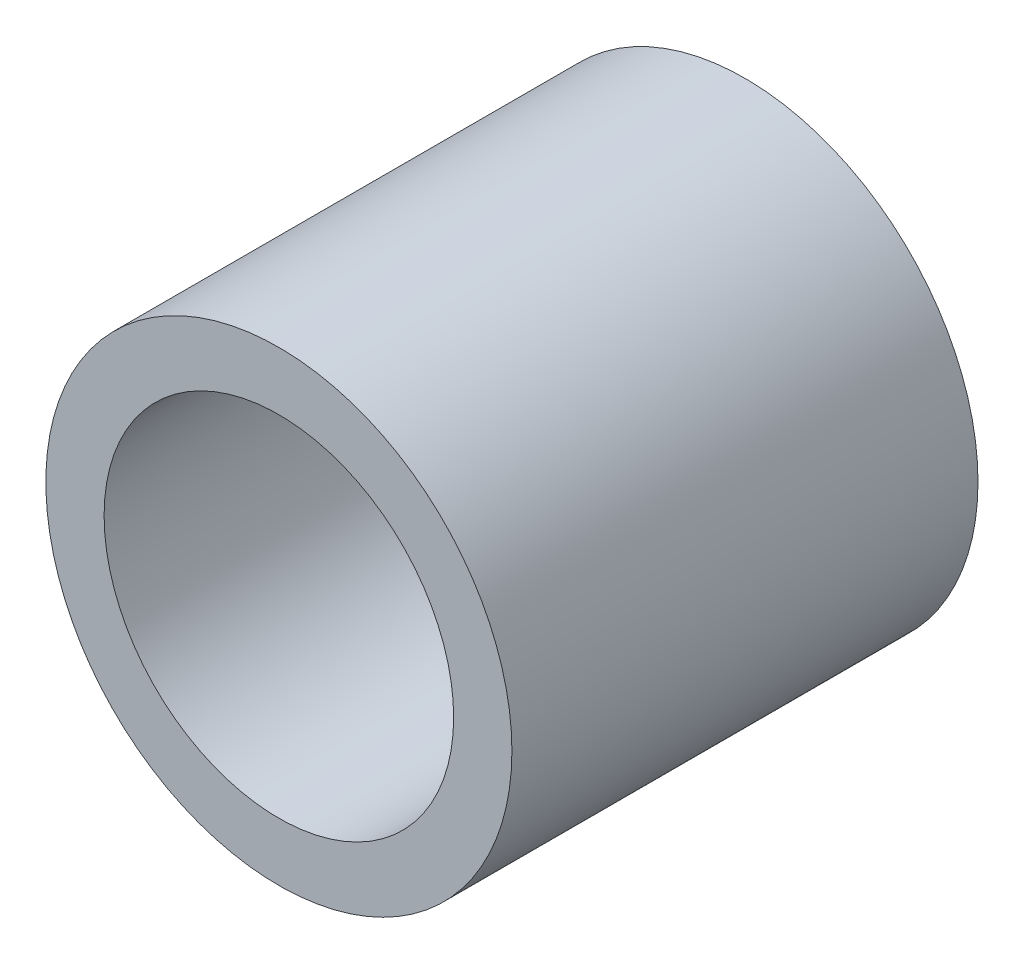
ISO-10303-21;
HEADER;
FILE_DESCRIPTION(('STEP AP214'),'2;1');
FILE_NAME('part.step','',(''),(''),'','','');
FILE_SCHEMA(('AUTOMOTIVE_DESIGN { 1 0 10303 214 1 1 1 1 }'));
ENDSEC;
DATA;
#1=APPLICATION_CONTEXT('core data for automotive mechanical design processes');
#2=APPLICATION_PROTOCOL_DEFINITION('international standard','automotive_design',2000,#1);
#3=PRODUCT_CONTEXT('',#1,'mechanical');
#4=PRODUCT('Part','Part','',(#3));
#5=PRODUCT_RELATED_PRODUCT_CATEGORY('part','',(#4));
#6=PRODUCT_DEFINITION_FORMATION('','',#4);
#7=PRODUCT_DEFINITION_CONTEXT('part definition',#1,'design');
#8=PRODUCT_DEFINITION('design','',#6,#7);
#9=PRODUCT_DEFINITION_SHAPE('','',#8);
#10=(LENGTH_UNIT() NAMED_UNIT(*) SI_UNIT(.MILLI.,.METRE.));
#11=(NAMED_UNIT(*) PLANE_ANGLE_UNIT() SI_UNIT($,.RADIAN.));
#12=(NAMED_UNIT(*) SI_UNIT($,.STERADIAN.) SOLID_ANGLE_UNIT());
#13=UNCERTAINTY_MEASURE_WITH_UNIT(LENGTH_MEASURE(1.E-05),#10,'distance_accuracy_value','');
#14=(GEOMETRIC_REPRESENTATION_CONTEXT(3) GLOBAL_UNCERTAINTY_ASSIGNED_CONTEXT((#13)) GLOBAL_UNIT_ASSIGNED_CONTEXT((#10,
#11,#12)) REPRESENTATION_CONTEXT('',''));
#15=CARTESIAN_POINT('',(0.,0.,0.));
#16=DIRECTION('',(0.,0.,1.));
#17=DIRECTION('',(1.,0.,0.));
#18=AXIS2_PLACEMENT_3D('',#15,#16,#17);
#19=CARTESIAN_POINT('',(0.,0.,12.7));
#20=DIRECTION('',(0.,0.,1.));
#21=DIRECTION('',(1.,0.,0.));
#22=AXIS2_PLACEMENT_3D('',#19,#20,#21);
#23=PLANE('',#22);
#24=CARTESIAN_POINT('',(0.,0.,12.7));
#25=DIRECTION('',(0.,0.,1.));
#26=DIRECTION('',(1.,0.,0.));
#27=AXIS2_PLACEMENT_3D('',#24,#25,#26);
#28=CIRCLE('',#27,12.7);
#29=CARTESIAN_POINT('',(12.7,0.,12.7));
#30=VERTEX_POINT('',#29);
#31=EDGE_CURVE('E10',#30,#30,#28,.T.);
#32=ORIENTED_EDGE('',*,*,#31,.T.);
#33=EDGE_LOOP('',(#32));
#34=FACE_BOUND('',#33,.T.);
#35=CARTESIAN_POINT('',(0.,0.,12.7));
#36=DIRECTION('',(0.,0.,1.));
#37=DIRECTION('',(1.,0.,0.));
#38=AXIS2_PLACEMENT_3D('',#35,#36,#37);
#39=CIRCLE('',#38,9.525);
#40=CARTESIAN_POINT('',(9.525,0.,12.7));
#41=VERTEX_POINT('',#40);
#42=EDGE_CURVE('E41',#41,#41,#39,.T.);
#43=ORIENTED_EDGE('',*,*,#42,.F.);
#44=EDGE_LOOP('',(#43));
#45=FACE_BOUND('',#44,.T.);
#46=ADVANCED_FACE('F30',(#34,#45),#23,.T.);
#47=CARTESIAN_POINT('',(0.,0.,-12.7));
#48=DIRECTION('',(0.,0.,1.));
#49=DIRECTION('',(1.,0.,0.));
#50=AXIS2_PLACEMENT_3D('',#47,#48,#49);
#51=PLANE('',#50);
#52=CARTESIAN_POINT('',(0.,0.,-12.7));
#53=DIRECTION('',(0.,0.,1.));
#54=DIRECTION('',(1.,0.,0.));
#55=AXIS2_PLACEMENT_3D('',#52,#53,#54);
#56=CIRCLE('',#55,12.7);
#57=CARTESIAN_POINT('',(12.7,0.,-12.7));
#58=VERTEX_POINT('',#57);
#59=EDGE_CURVE('E34',#58,#58,#56,.T.);
#60=ORIENTED_EDGE('',*,*,#59,.F.);
#61=EDGE_LOOP('',(#60));
#62=FACE_BOUND('',#61,.T.);
#63=CARTESIAN_POINT('',(0.,0.,-12.7));
#64=DIRECTION('',(0.,0.,1.));
#65=DIRECTION('',(1.,0.,0.));
#66=AXIS2_PLACEMENT_3D('',#63,#64,#65);
#67=CIRCLE('',#66,9.525);
#68=CARTESIAN_POINT('',(9.525,0.,-12.7));
#69=VERTEX_POINT('',#68);
#70=EDGE_CURVE('E43',#69,#69,#67,.T.);
#71=ORIENTED_EDGE('',*,*,#70,.T.);
#72=EDGE_LOOP('',(#71));
#73=FACE_BOUND('',#72,.T.);
#74=ADVANCED_FACE('F53',(#62,#73),#51,.F.);
#75=CARTESIAN_POINT('',(0.,0.,12.7));
#76=DIRECTION('',(0.,0.,-1.));
#77=DIRECTION('',(-1.,0.,0.));
#78=AXIS2_PLACEMENT_3D('',#75,#76,#77);
#79=CYLINDRICAL_SURFACE('',#78,12.7);
#80=ORIENTED_EDGE('',*,*,#31,.F.);
#81=EDGE_LOOP('',(#80));
#82=FACE_BOUND('',#81,.T.);
#83=ORIENTED_EDGE('',*,*,#59,.T.);
#84=EDGE_LOOP('',(#83));
#85=FACE_BOUND('',#84,.T.);
#86=ADVANCED_FACE('F32',(#82,#85),#79,.T.);
#87=CARTESIAN_POINT('',(0.,0.,12.7));
#88=DIRECTION('',(0.,0.,-1.));
#89=DIRECTION('',(-1.,0.,0.));
#90=AXIS2_PLACEMENT_3D('',#87,#88,#89);
#91=CYLINDRICAL_SURFACE('',#90,9.525);
#92=ORIENTED_EDGE('',*,*,#42,.T.);
#93=EDGE_LOOP('',(#92));
#94=FACE_BOUND('',#93,.T.);
#95=ORIENTED_EDGE('',*,*,#70,.F.);
#96=EDGE_LOOP('',(#95));
#97=FACE_BOUND('',#96,.T.);
#98=ADVANCED_FACE('F49',(#94,#97),#91,.F.);
#99=CLOSED_SHELL('',(#46,#74,#86,#98));
#100=MANIFOLD_SOLID_BREP('B2',#99);
#101=ADVANCED_BREP_SHAPE_REPRESENTATION('',(#18,#100),#14);
#102=SHAPE_DEFINITION_REPRESENTATION(#9,#101);
ENDSEC;
END-ISO-10303-21;
